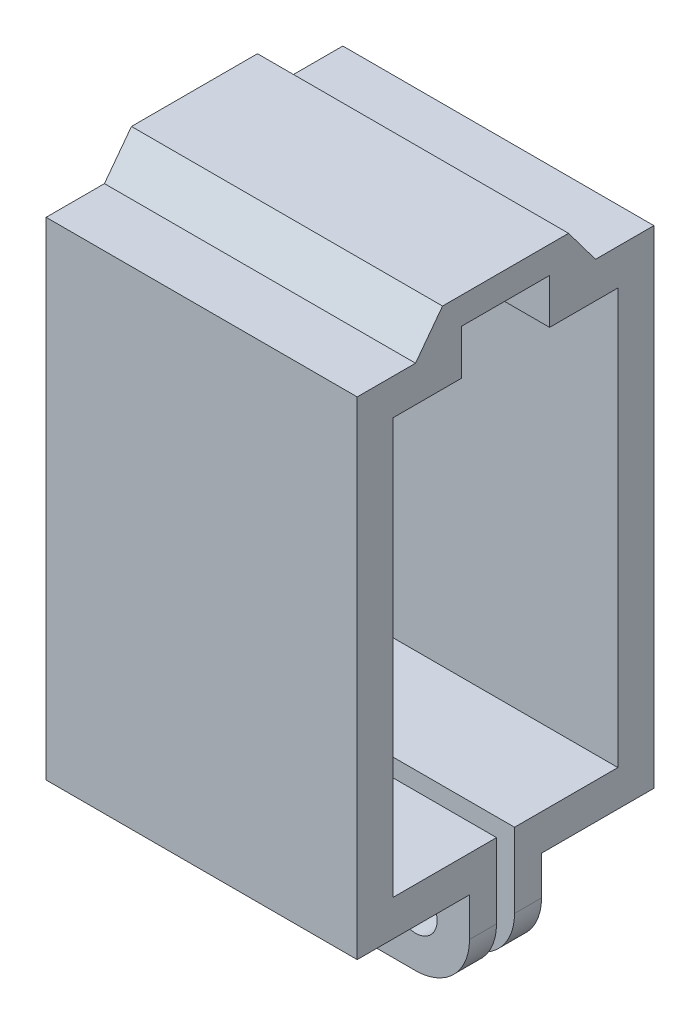
ISO-10303-21;
HEADER;
FILE_DESCRIPTION(('STEP AP214'),'2;1');
FILE_NAME('part.step','',(''),(''),'','','');
FILE_SCHEMA(('AUTOMOTIVE_DESIGN { 1 0 10303 214 1 1 1 1 }'));
ENDSEC;
DATA;
#1=APPLICATION_CONTEXT('core data for automotive mechanical design processes');
#2=APPLICATION_PROTOCOL_DEFINITION('international standard','automotive_design',2000,#1);
#3=PRODUCT_CONTEXT('',#1,'mechanical');
#4=PRODUCT('Part','Part','',(#3));
#5=PRODUCT_RELATED_PRODUCT_CATEGORY('part','',(#4));
#6=PRODUCT_DEFINITION_FORMATION('','',#4);
#7=PRODUCT_DEFINITION_CONTEXT('part definition',#1,'design');
#8=PRODUCT_DEFINITION('design','',#6,#7);
#9=PRODUCT_DEFINITION_SHAPE('','',#8);
#10=(LENGTH_UNIT() NAMED_UNIT(*) SI_UNIT(.MILLI.,.METRE.));
#11=(NAMED_UNIT(*) PLANE_ANGLE_UNIT() SI_UNIT($,.RADIAN.));
#12=(NAMED_UNIT(*) SI_UNIT($,.STERADIAN.) SOLID_ANGLE_UNIT());
#13=UNCERTAINTY_MEASURE_WITH_UNIT(LENGTH_MEASURE(1.E-05),#10,'distance_accuracy_value','');
#14=(GEOMETRIC_REPRESENTATION_CONTEXT(3) GLOBAL_UNCERTAINTY_ASSIGNED_CONTEXT((#13)) GLOBAL_UNIT_ASSIGNED_CONTEXT((#10,
#11,#12)) REPRESENTATION_CONTEXT('',''));
#15=CARTESIAN_POINT('',(0.,0.,0.));
#16=DIRECTION('',(0.,0.,1.));
#17=DIRECTION('',(1.,0.,0.));
#18=AXIS2_PLACEMENT_3D('',#15,#16,#17);
#19=CARTESIAN_POINT('',(49.4724202470213,-16.8311,6.23999999999999));
#20=DIRECTION('',(0.,1.,0.));
#21=DIRECTION('',(0.,0.,1.));
#22=AXIS2_PLACEMENT_3D('',#19,#20,#21);
#23=PLANE('',#22);
#24=DIRECTION('',(1.,0.,0.));
#25=VECTOR('',#24,1.);
#26=CARTESIAN_POINT('',(0.,-16.8311,0.500000000000001));
#27=LINE('',#26,#25);
#28=CARTESIAN_POINT('',(0.,-16.8311,0.500000000000001));
#29=VERTEX_POINT('',#28);
#30=CARTESIAN_POINT('',(17.2796,-16.8311,0.500000000000006));
#31=VERTEX_POINT('',#30);
#32=EDGE_CURVE('E229',#29,#31,#27,.T.);
#33=ORIENTED_EDGE('',*,*,#32,.F.);
#34=DIRECTION('',(0.,0.,-1.));
#35=VECTOR('',#34,1.);
#36=CARTESIAN_POINT('',(0.,-16.8311,6.23999999999999));
#37=LINE('',#36,#35);
#38=CARTESIAN_POINT('',(0.,-16.8311,6.23999999999999));
#39=VERTEX_POINT('',#38);
#40=EDGE_CURVE('E248',#39,#29,#37,.T.);
#41=ORIENTED_EDGE('',*,*,#40,.F.);
#42=DIRECTION('',(-1.,0.,0.));
#43=VECTOR('',#42,1.);
#44=CARTESIAN_POINT('',(49.4724202470213,-16.8311,6.23999999999999));
#45=LINE('',#44,#43);
#46=CARTESIAN_POINT('',(17.2796,-16.8311,6.23999999999999));
#47=VERTEX_POINT('',#46);
#48=EDGE_CURVE('E257',#47,#39,#45,.T.);
#49=ORIENTED_EDGE('',*,*,#48,.F.);
#50=DIRECTION('',(0.,0.,-1.));
#51=VECTOR('',#50,1.);
#52=CARTESIAN_POINT('',(17.2796,-16.8311,6.23999999999998));
#53=LINE('',#52,#51);
#54=EDGE_CURVE('E288',#47,#31,#53,.T.);
#55=ORIENTED_EDGE('',*,*,#54,.T.);
#56=EDGE_LOOP('',(#33,#41,#49,#55));
#57=FACE_BOUND('',#56,.T.);
#58=ADVANCED_FACE('F35',(#57),#23,.T.);
#59=CARTESIAN_POINT('',(-6.5209278480905,-23.9811000000002,2.));
#60=DIRECTION('',(0.,-1.,0.));
#61=DIRECTION('',(0.,0.,-1.));
#62=AXIS2_PLACEMENT_3D('',#59,#60,#61);
#63=PLANE('',#62);
#64=DIRECTION('',(1.,0.,0.));
#65=VECTOR('',#64,1.);
#66=CARTESIAN_POINT('',(0.,-23.9811000000002,0.5));
#67=LINE('',#66,#65);
#68=CARTESIAN_POINT('',(3.,-23.9811000000002,0.500000000000001));
#69=VERTEX_POINT('',#68);
#70=CARTESIAN_POINT('',(14.2796000000001,-23.9811000000002,0.500000000000004));
#71=VERTEX_POINT('',#70);
#72=EDGE_CURVE('E241',#69,#71,#67,.T.);
#73=ORIENTED_EDGE('',*,*,#72,.T.);
#74=DIRECTION('',(0.,0.,-1.));
#75=VECTOR('',#74,1.);
#76=CARTESIAN_POINT('',(14.2796,-23.9811000000002,2.00000000000001));
#77=LINE('',#76,#75);
#78=CARTESIAN_POINT('',(14.2796,-23.9811000000002,2.00000000000001));
#79=VERTEX_POINT('',#78);
#80=EDGE_CURVE('E299',#71,#79,#77,.F.);
#81=ORIENTED_EDGE('',*,*,#80,.T.);
#82=DIRECTION('',(1.,0.,0.));
#83=VECTOR('',#82,1.);
#84=CARTESIAN_POINT('',(-6.5209278480905,-23.9811000000002,2.));
#85=LINE('',#84,#83);
#86=CARTESIAN_POINT('',(3.,-23.9811000000002,2.));
#87=VERTEX_POINT('',#86);
#88=EDGE_CURVE('E359',#87,#79,#85,.T.);
#89=ORIENTED_EDGE('',*,*,#88,.F.);
#90=DIRECTION('',(0.,0.,1.));
#91=VECTOR('',#90,1.);
#92=CARTESIAN_POINT('',(3.,-23.9811,-2.));
#93=LINE('',#92,#91);
#94=EDGE_CURVE('E304',#87,#69,#93,.F.);
#95=ORIENTED_EDGE('',*,*,#94,.T.);
#96=EDGE_LOOP('',(#73,#81,#89,#95));
#97=FACE_BOUND('',#96,.T.);
#98=ADVANCED_FACE('F550',(#97),#63,.T.);
#99=CARTESIAN_POINT('',(3.,-20.9811000000001,-1.14648681173724E-12));
#100=DIRECTION('',(0.,0.,-1.));
#101=DIRECTION('',(0.,1.,0.));
#102=AXIS2_PLACEMENT_3D('',#99,#100,#101);
#103=CYLINDRICAL_SURFACE('',#102,3.);
#104=CARTESIAN_POINT('',(3.,-20.9811000000001,0.500000000000002));
#105=DIRECTION('',(0.,0.,1.));
#106=DIRECTION('',(1.,0.,0.));
#107=AXIS2_PLACEMENT_3D('',#104,#105,#106);
#108=CIRCLE('',#107,3.);
#109=CARTESIAN_POINT('',(0.,-20.9811000000001,0.500000000000001));
#110=VERTEX_POINT('',#109);
#111=EDGE_CURVE('E346',#69,#110,#108,.F.);
#112=ORIENTED_EDGE('',*,*,#111,.F.);
#113=ORIENTED_EDGE('',*,*,#94,.F.);
#114=CARTESIAN_POINT('',(3.,-20.9811000000002,2.));
#115=DIRECTION('',(0.,0.,1.));
#116=DIRECTION('',(1.,0.,0.));
#117=AXIS2_PLACEMENT_3D('',#114,#115,#116);
#118=CIRCLE('',#117,3.);
#119=CARTESIAN_POINT('',(0.,-20.9811000000002,2.));
#120=VERTEX_POINT('',#119);
#121=EDGE_CURVE('E297',#120,#87,#118,.T.);
#122=ORIENTED_EDGE('',*,*,#121,.F.);
#123=DIRECTION('',(0.,0.,1.));
#124=VECTOR('',#123,1.);
#125=CARTESIAN_POINT('',(0.,-20.9811000000002,2.00000000000017));
#126=LINE('',#125,#124);
#127=EDGE_CURVE('E293',#110,#120,#126,.T.);
#128=ORIENTED_EDGE('',*,*,#127,.F.);
#129=EDGE_LOOP('',(#112,#113,#122,#128));
#130=FACE_BOUND('',#129,.T.);
#131=ADVANCED_FACE('F463',(#130),#103,.T.);
#132=CARTESIAN_POINT('',(14.2796000000001,-20.9810999999998,-6.09000000000162));
#133=DIRECTION('',(0.,0.,-1.));
#134=DIRECTION('',(0.,1.,0.));
#135=AXIS2_PLACEMENT_3D('',#132,#133,#134);
#136=CYLINDRICAL_SURFACE('',#135,3.);
#137=CARTESIAN_POINT('',(14.2796000000001,-20.9811000000001,0.500000000000005));
#138=DIRECTION('',(0.,0.,1.));
#139=DIRECTION('',(1.,0.,0.));
#140=AXIS2_PLACEMENT_3D('',#137,#138,#139);
#141=CIRCLE('',#140,3.);
#142=CARTESIAN_POINT('',(17.2796,-20.9811000000001,0.500000000000006));
#143=VERTEX_POINT('',#142);
#144=EDGE_CURVE('E11',#143,#71,#141,.F.);
#145=ORIENTED_EDGE('',*,*,#144,.F.);
#146=DIRECTION('',(0.,0.,-1.));
#147=VECTOR('',#146,1.);
#148=CARTESIAN_POINT('',(17.2796000000001,-20.9810999999998,-6.09000000000162));
#149=LINE('',#148,#147);
#150=CARTESIAN_POINT('',(17.2796,-20.9811000000002,2.00000000000001));
#151=VERTEX_POINT('',#150);
#152=EDGE_CURVE('E312',#151,#143,#149,.T.);
#153=ORIENTED_EDGE('',*,*,#152,.F.);
#154=CARTESIAN_POINT('',(14.2796,-20.9811000000002,2.));
#155=DIRECTION('',(0.,0.,1.));
#156=DIRECTION('',(1.,0.,0.));
#157=AXIS2_PLACEMENT_3D('',#154,#155,#156);
#158=CIRCLE('',#157,3.);
#159=EDGE_CURVE('E295',#79,#151,#158,.T.);
#160=ORIENTED_EDGE('',*,*,#159,.F.);
#161=ORIENTED_EDGE('',*,*,#80,.F.);
#162=EDGE_LOOP('',(#145,#153,#160,#161));
#163=FACE_BOUND('',#162,.T.);
#164=ADVANCED_FACE('F546',(#163),#136,.T.);
#165=CARTESIAN_POINT('',(49.4724202470213,-18.8311,8.23999999999999));
#166=DIRECTION('',(0.,1.,0.));
#167=DIRECTION('',(0.,0.,1.));
#168=AXIS2_PLACEMENT_3D('',#165,#166,#167);
#169=PLANE('',#168);
#170=DIRECTION('',(1.,0.,0.));
#171=VECTOR('',#170,1.);
#172=CARTESIAN_POINT('',(-6.5209278480905,-18.8311,-2.));
#173=LINE('',#172,#171);
#174=CARTESIAN_POINT('',(0.,-18.8311,-1.99999999999999));
#175=VERTEX_POINT('',#174);
#176=CARTESIAN_POINT('',(17.2796,-18.8311,-1.99999999999999));
#177=VERTEX_POINT('',#176);
#178=EDGE_CURVE('E361',#175,#177,#173,.T.);
#179=ORIENTED_EDGE('',*,*,#178,.F.);
#180=DIRECTION('',(0.,0.,-1.));
#181=VECTOR('',#180,1.);
#182=CARTESIAN_POINT('',(0.,-18.8311,8.23999999999999));
#183=LINE('',#182,#181);
#184=CARTESIAN_POINT('',(0.,-18.8311,-8.24000000000001));
#185=VERTEX_POINT('',#184);
#186=EDGE_CURVE('E273',#175,#185,#183,.T.);
#187=ORIENTED_EDGE('',*,*,#186,.T.);
#188=DIRECTION('',(-1.,0.,0.));
#189=VECTOR('',#188,1.);
#190=CARTESIAN_POINT('',(49.4724202470213,-18.8311,-8.24000000000001));
#191=LINE('',#190,#189);
#192=CARTESIAN_POINT('',(17.2796,-18.8311,-8.24));
#193=VERTEX_POINT('',#192);
#194=EDGE_CURVE('E277',#193,#185,#191,.T.);
#195=ORIENTED_EDGE('',*,*,#194,.F.);
#196=DIRECTION('',(0.,0.,-1.));
#197=VECTOR('',#196,1.);
#198=CARTESIAN_POINT('',(17.2796,-18.8311,8.23999999999998));
#199=LINE('',#198,#197);
#200=EDGE_CURVE('E426',#177,#193,#199,.T.);
#201=ORIENTED_EDGE('',*,*,#200,.F.);
#202=EDGE_LOOP('',(#179,#187,#195,#201));
#203=FACE_BOUND('',#202,.T.);
#204=ADVANCED_FACE('F663',(#203),#169,.F.);
#205=CARTESIAN_POINT('',(49.4724202470213,6.24,-6.24000000000001));
#206=DIRECTION('',(0.,-1.,0.));
#207=DIRECTION('',(0.,0.,-1.));
#208=AXIS2_PLACEMENT_3D('',#205,#206,#207);
#209=PLANE('',#208);
#210=DIRECTION('',(-1.,0.,0.));
#211=VECTOR('',#210,1.);
#212=CARTESIAN_POINT('',(49.4724202470213,6.24,2.44779999999987));
#213=LINE('',#212,#211);
#214=CARTESIAN_POINT('',(17.2796,6.24,2.44779999999986));
#215=VERTEX_POINT('',#214);
#216=CARTESIAN_POINT('',(0.,6.24,2.44779999999985));
#217=VERTEX_POINT('',#216);
#218=EDGE_CURVE('E389',#215,#217,#213,.T.);
#219=ORIENTED_EDGE('',*,*,#218,.F.);
#220=DIRECTION('',(0.,0.,1.));
#221=VECTOR('',#220,1.);
#222=CARTESIAN_POINT('',(17.2796,6.24,-6.24000000000002));
#223=LINE('',#222,#221);
#224=CARTESIAN_POINT('',(17.2796,6.24,6.23999999999999));
#225=VERTEX_POINT('',#224);
#226=EDGE_CURVE('E419',#215,#225,#223,.T.);
#227=ORIENTED_EDGE('',*,*,#226,.T.);
#228=DIRECTION('',(-1.,0.,0.));
#229=VECTOR('',#228,1.);
#230=CARTESIAN_POINT('',(49.4724202470213,6.24,6.23999999999999));
#231=LINE('',#230,#229);
#232=CARTESIAN_POINT('',(0.,6.24,6.23999999999999));
#233=VERTEX_POINT('',#232);
#234=EDGE_CURVE('E259',#225,#233,#231,.T.);
#235=ORIENTED_EDGE('',*,*,#234,.T.);
#236=DIRECTION('',(0.,0.,1.));
#237=VECTOR('',#236,1.);
#238=CARTESIAN_POINT('',(0.,6.24,-6.24000000000001));
#239=LINE('',#238,#237);
#240=EDGE_CURVE('E441',#217,#233,#239,.T.);
#241=ORIENTED_EDGE('',*,*,#240,.F.);
#242=EDGE_LOOP('',(#219,#227,#235,#241));
#243=FACE_BOUND('',#242,.T.);
#244=ADVANCED_FACE('F450',(#243),#209,.T.);
#245=CARTESIAN_POINT('',(49.4724202470213,8.24,-8.24000000000001));
#246=DIRECTION('',(0.,-1.,0.));
#247=DIRECTION('',(0.,0.,-1.));
#248=AXIS2_PLACEMENT_3D('',#245,#246,#247);
#249=PLANE('',#248);
#250=DIRECTION('',(1.,0.,0.));
#251=VECTOR('',#250,1.);
#252=CARTESIAN_POINT('',(-10.1980390271856,8.23999999999999,5.));
#253=LINE('',#252,#251);
#254=CARTESIAN_POINT('',(0.,8.23999999999999,5.00000000000001));
#255=VERTEX_POINT('',#254);
#256=CARTESIAN_POINT('',(17.2796,8.23999999999999,5.00000000000001));
#257=VERTEX_POINT('',#256);
#258=EDGE_CURVE('E409',#255,#257,#253,.T.);
#259=ORIENTED_EDGE('',*,*,#258,.F.);
#260=DIRECTION('',(0.,0.,1.));
#261=VECTOR('',#260,1.);
#262=CARTESIAN_POINT('',(0.,8.24,-8.24000000000001));
#263=LINE('',#262,#261);
#264=CARTESIAN_POINT('',(0.,8.23999999999999,8.23999999999999));
#265=VERTEX_POINT('',#264);
#266=EDGE_CURVE('E267',#255,#265,#263,.T.);
#267=ORIENTED_EDGE('',*,*,#266,.T.);
#268=DIRECTION('',(-1.,0.,0.));
#269=VECTOR('',#268,1.);
#270=CARTESIAN_POINT('',(49.4724202470213,8.23999999999999,8.23999999999999));
#271=LINE('',#270,#269);
#272=CARTESIAN_POINT('',(17.2796,8.23999999999999,8.23999999999999));
#273=VERTEX_POINT('',#272);
#274=EDGE_CURVE('E282',#273,#265,#271,.T.);
#275=ORIENTED_EDGE('',*,*,#274,.F.);
#276=DIRECTION('',(0.,0.,1.));
#277=VECTOR('',#276,1.);
#278=CARTESIAN_POINT('',(17.2796,8.24,-8.24000000000002));
#279=LINE('',#278,#277);
#280=EDGE_CURVE('E433',#257,#273,#279,.T.);
#281=ORIENTED_EDGE('',*,*,#280,.F.);
#282=EDGE_LOOP('',(#259,#267,#275,#281));
#283=FACE_BOUND('',#282,.T.);
#284=ADVANCED_FACE('F748',(#283),#249,.F.);
#285=CARTESIAN_POINT('',(0.,-18.8311,8.23999999999999));
#286=VERTEX_POINT('',#285);
#287=CARTESIAN_POINT('',(0.,-18.8311,2.00000000000001));
#288=VERTEX_POINT('',#287);
#289=EDGE_CURVE('E274',#286,#288,#183,.T.);
#290=ORIENTED_EDGE('',*,*,#289,.T.);
#291=DIRECTION('',(1.,0.,0.));
#292=VECTOR('',#291,1.);
#293=CARTESIAN_POINT('',(-6.5209278480905,-18.8311,2.));
#294=LINE('',#293,#292);
#295=CARTESIAN_POINT('',(17.2796,-18.8311,2.00000000000001));
#296=VERTEX_POINT('',#295);
#297=EDGE_CURVE('E352',#288,#296,#294,.T.);
#298=ORIENTED_EDGE('',*,*,#297,.T.);
#299=CARTESIAN_POINT('',(17.2796,-18.8311,8.23999999999999));
#300=VERTEX_POINT('',#299);
#301=EDGE_CURVE('E427',#300,#296,#199,.T.);
#302=ORIENTED_EDGE('',*,*,#301,.F.);
#303=DIRECTION('',(-1.,0.,0.));
#304=VECTOR('',#303,1.);
#305=CARTESIAN_POINT('',(49.4724202470213,-18.8311,8.23999999999999));
#306=LINE('',#305,#304);
#307=EDGE_CURVE('E280',#300,#286,#306,.T.);
#308=ORIENTED_EDGE('',*,*,#307,.T.);
#309=EDGE_LOOP('',(#290,#298,#302,#308));
#310=FACE_BOUND('',#309,.T.);
#311=ADVANCED_FACE('F474',(#310),#169,.F.);
#312=CARTESIAN_POINT('',(49.4724202470213,8.23999999999999,8.23999999999999));
#313=DIRECTION('',(0.,0.,-1.));
#314=DIRECTION('',(0.,1.,0.));
#315=AXIS2_PLACEMENT_3D('',#312,#313,#314);
#316=PLANE('',#315);
#317=DIRECTION('',(0.,-1.,0.));
#318=VECTOR('',#317,1.);
#319=CARTESIAN_POINT('',(17.2796,8.23999999999999,8.23999999999999));
#320=LINE('',#319,#318);
#321=EDGE_CURVE('E430',#273,#300,#320,.T.);
#322=ORIENTED_EDGE('',*,*,#321,.F.);
#323=ORIENTED_EDGE('',*,*,#274,.T.);
#324=DIRECTION('',(0.,-1.,0.));
#325=VECTOR('',#324,1.);
#326=CARTESIAN_POINT('',(0.,8.23999999999999,8.23999999999999));
#327=LINE('',#326,#325);
#328=EDGE_CURVE('E270',#265,#286,#327,.T.);
#329=ORIENTED_EDGE('',*,*,#328,.T.);
#330=ORIENTED_EDGE('',*,*,#307,.F.);
#331=EDGE_LOOP('',(#322,#323,#329,#330));
#332=FACE_BOUND('',#331,.T.);
#333=ADVANCED_FACE('F478',(#332),#316,.F.);
#334=CARTESIAN_POINT('',(0.,8.24,-8.24000000000001));
#335=VERTEX_POINT('',#334);
#336=CARTESIAN_POINT('',(0.,8.24,-5.));
#337=VERTEX_POINT('',#336);
#338=EDGE_CURVE('E268',#335,#337,#263,.T.);
#339=ORIENTED_EDGE('',*,*,#338,.T.);
#340=DIRECTION('',(1.,0.,0.));
#341=VECTOR('',#340,1.);
#342=CARTESIAN_POINT('',(-10.1980390271856,8.23999999999999,-5.));
#343=LINE('',#342,#341);
#344=CARTESIAN_POINT('',(17.2796,8.24,-5.));
#345=VERTEX_POINT('',#344);
#346=EDGE_CURVE('E413',#337,#345,#343,.T.);
#347=ORIENTED_EDGE('',*,*,#346,.T.);
#348=CARTESIAN_POINT('',(17.2796,8.24,-8.24000000000001));
#349=VERTEX_POINT('',#348);
#350=EDGE_CURVE('E434',#349,#345,#279,.T.);
#351=ORIENTED_EDGE('',*,*,#350,.F.);
#352=DIRECTION('',(-1.,0.,0.));
#353=VECTOR('',#352,1.);
#354=CARTESIAN_POINT('',(49.4724202470213,8.24,-8.24000000000001));
#355=LINE('',#354,#353);
#356=EDGE_CURVE('E285',#349,#335,#355,.T.);
#357=ORIENTED_EDGE('',*,*,#356,.T.);
#358=EDGE_LOOP('',(#339,#347,#351,#357));
#359=FACE_BOUND('',#358,.T.);
#360=ADVANCED_FACE('F499',(#359),#249,.F.);
#361=CARTESIAN_POINT('',(49.4724202470213,-18.8311,-8.24000000000001));
#362=DIRECTION('',(0.,0.,1.));
#363=DIRECTION('',(1.,0.,0.));
#364=AXIS2_PLACEMENT_3D('',#361,#362,#363);
#365=PLANE('',#364);
#366=DIRECTION('',(0.,1.,0.));
#367=VECTOR('',#366,1.);
#368=CARTESIAN_POINT('',(17.2796,-18.8311,-8.24000000000001));
#369=LINE('',#368,#367);
#370=EDGE_CURVE('E437',#193,#349,#369,.T.);
#371=ORIENTED_EDGE('',*,*,#370,.F.);
#372=ORIENTED_EDGE('',*,*,#194,.T.);
#373=DIRECTION('',(0.,1.,0.));
#374=VECTOR('',#373,1.);
#375=CARTESIAN_POINT('',(0.,-18.8311,-8.24000000000001));
#376=LINE('',#375,#374);
#377=EDGE_CURVE('E264',#185,#335,#376,.T.);
#378=ORIENTED_EDGE('',*,*,#377,.T.);
#379=ORIENTED_EDGE('',*,*,#356,.F.);
#380=EDGE_LOOP('',(#371,#372,#378,#379));
#381=FACE_BOUND('',#380,.T.);
#382=ADVANCED_FACE('F507',(#381),#365,.F.);
#383=CARTESIAN_POINT('',(0.,0.,0.));
#384=DIRECTION('',(1.,0.,0.));
#385=DIRECTION('',(0.,0.,-1.));
#386=AXIS2_PLACEMENT_3D('',#383,#384,#385);
#387=PLANE('',#386);
#388=ORIENTED_EDGE('',*,*,#40,.T.);
#389=DIRECTION('',(0.,-1.,0.));
#390=VECTOR('',#389,1.);
#391=CARTESIAN_POINT('',(0.,-16.8311,0.500000000000001));
#392=LINE('',#391,#390);
#393=EDGE_CURVE('E242',#29,#110,#392,.T.);
#394=ORIENTED_EDGE('',*,*,#393,.T.);
#395=ORIENTED_EDGE('',*,*,#127,.T.);
#396=DIRECTION('',(0.,1.,0.));
#397=VECTOR('',#396,1.);
#398=CARTESIAN_POINT('',(0.,-18.8311,2.));
#399=LINE('',#398,#397);
#400=EDGE_CURVE('E351',#120,#288,#399,.T.);
#401=ORIENTED_EDGE('',*,*,#400,.T.);
#402=ORIENTED_EDGE('',*,*,#289,.F.);
#403=ORIENTED_EDGE('',*,*,#328,.F.);
#404=ORIENTED_EDGE('',*,*,#266,.F.);
#405=DIRECTION('',(0.,0.8,-0.6));
#406=VECTOR('',#405,1.);
#407=CARTESIAN_POINT('',(0.,8.24,5.));
#408=LINE('',#407,#406);
#409=CARTESIAN_POINT('',(0.,10.24,3.50000000000001));
#410=VERTEX_POINT('',#409);
#411=EDGE_CURVE('E398',#255,#410,#408,.T.);
#412=ORIENTED_EDGE('',*,*,#411,.T.);
#413=DIRECTION('',(0.,0.,-1.));
#414=VECTOR('',#413,1.);
#415=CARTESIAN_POINT('',(0.,10.24,3.5));
#416=LINE('',#415,#414);
#417=CARTESIAN_POINT('',(0.,10.24,-3.5));
#418=VERTEX_POINT('',#417);
#419=EDGE_CURVE('E395',#410,#418,#416,.T.);
#420=ORIENTED_EDGE('',*,*,#419,.T.);
#421=DIRECTION('',(0.,-0.8,-0.6));
#422=VECTOR('',#421,1.);
#423=CARTESIAN_POINT('',(0.,8.23999999999999,-5.));
#424=LINE('',#423,#422);
#425=EDGE_CURVE('E392',#418,#337,#424,.T.);
#426=ORIENTED_EDGE('',*,*,#425,.T.);
#427=ORIENTED_EDGE('',*,*,#338,.F.);
#428=ORIENTED_EDGE('',*,*,#377,.F.);
#429=ORIENTED_EDGE('',*,*,#186,.F.);
#430=DIRECTION('',(0.,-1.,0.));
#431=VECTOR('',#430,1.);
#432=CARTESIAN_POINT('',(0.,-18.8311,-2.));
#433=LINE('',#432,#431);
#434=CARTESIAN_POINT('',(0.,-20.9811,-2.));
#435=VERTEX_POINT('',#434);
#436=EDGE_CURVE('E349',#175,#435,#433,.T.);
#437=ORIENTED_EDGE('',*,*,#436,.T.);
#438=CARTESIAN_POINT('',(0.,-20.9811000000001,-0.499999999999998));
#439=VERTEX_POINT('',#438);
#440=EDGE_CURVE('E240',#435,#439,#126,.T.);
#441=ORIENTED_EDGE('',*,*,#440,.T.);
#442=DIRECTION('',(0.,1.,0.));
#443=VECTOR('',#442,1.);
#444=CARTESIAN_POINT('',(0.,-16.8311,-0.499999999999999));
#445=LINE('',#444,#443);
#446=CARTESIAN_POINT('',(0.,-16.8311,-0.499999999999999));
#447=VERTEX_POINT('',#446);
#448=EDGE_CURVE('E222',#439,#447,#445,.T.);
#449=ORIENTED_EDGE('',*,*,#448,.T.);
#450=CARTESIAN_POINT('',(0.,-16.8311,-6.24000000000001));
#451=VERTEX_POINT('',#450);
#452=EDGE_CURVE('E236',#447,#451,#37,.T.);
#453=ORIENTED_EDGE('',*,*,#452,.T.);
#454=DIRECTION('',(0.,1.,0.));
#455=VECTOR('',#454,1.);
#456=CARTESIAN_POINT('',(0.,-16.8311,-6.24000000000001));
#457=LINE('',#456,#455);
#458=CARTESIAN_POINT('',(0.,6.24,-6.24000000000001));
#459=VERTEX_POINT('',#458);
#460=EDGE_CURVE('E440',#451,#459,#457,.T.);
#461=ORIENTED_EDGE('',*,*,#460,.T.);
#462=CARTESIAN_POINT('',(0.,6.24,-2.44780000000015));
#463=VERTEX_POINT('',#462);
#464=EDGE_CURVE('E252',#459,#463,#239,.T.);
#465=ORIENTED_EDGE('',*,*,#464,.T.);
#466=DIRECTION('',(0.,1.,0.));
#467=VECTOR('',#466,1.);
#468=CARTESIAN_POINT('',(0.,5.09000000000005,-2.44780000000015));
#469=LINE('',#468,#467);
#470=CARTESIAN_POINT('',(0.,8.74,-2.44780000000015));
#471=VERTEX_POINT('',#470);
#472=EDGE_CURVE('E372',#463,#471,#469,.T.);
#473=ORIENTED_EDGE('',*,*,#472,.T.);
#474=DIRECTION('',(0.,0.,1.));
#475=VECTOR('',#474,1.);
#476=CARTESIAN_POINT('',(0.,8.74,2.44779999999985));
#477=LINE('',#476,#475);
#478=CARTESIAN_POINT('',(0.,8.74,2.44779999999985));
#479=VERTEX_POINT('',#478);
#480=EDGE_CURVE('E376',#471,#479,#477,.T.);
#481=ORIENTED_EDGE('',*,*,#480,.T.);
#482=DIRECTION('',(0.,-1.,0.));
#483=VECTOR('',#482,1.);
#484=CARTESIAN_POINT('',(0.,8.74,2.44779999999985));
#485=LINE('',#484,#483);
#486=EDGE_CURVE('E369',#479,#217,#485,.T.);
#487=ORIENTED_EDGE('',*,*,#486,.T.);
#488=ORIENTED_EDGE('',*,*,#240,.T.);
#489=DIRECTION('',(0.,-1.,0.));
#490=VECTOR('',#489,1.);
#491=CARTESIAN_POINT('',(0.,6.24,6.23999999999999));
#492=LINE('',#491,#490);
#493=EDGE_CURVE('E249',#233,#39,#492,.T.);
#494=ORIENTED_EDGE('',*,*,#493,.T.);
#495=EDGE_LOOP('',(#388,#394,#395,#401,#402,#403,#404,#412,#420,#426,#427,#428,#429,#437,#441,
#449,#453,#461,#465,#473,#481,#487,#488,#494));
#496=FACE_BOUND('',#495,.T.);
#497=ADVANCED_FACE('F234',(#496),#387,.F.);
#498=DIRECTION('',(1.,0.,0.));
#499=VECTOR('',#498,1.);
#500=CARTESIAN_POINT('',(0.,-16.8311,-0.499999999999999));
#501=LINE('',#500,#499);
#502=CARTESIAN_POINT('',(17.2796,-16.8311,-0.499999999999994));
#503=VERTEX_POINT('',#502);
#504=EDGE_CURVE('E219',#447,#503,#501,.T.);
#505=ORIENTED_EDGE('',*,*,#504,.T.);
#506=CARTESIAN_POINT('',(17.2796,-16.8311,-6.24000000000001));
#507=VERTEX_POINT('',#506);
#508=EDGE_CURVE('E287',#503,#507,#53,.T.);
#509=ORIENTED_EDGE('',*,*,#508,.T.);
#510=DIRECTION('',(-1.,0.,0.));
#511=VECTOR('',#510,1.);
#512=CARTESIAN_POINT('',(49.4724202470213,-16.8311,-6.24000000000001));
#513=LINE('',#512,#511);
#514=EDGE_CURVE('E246',#507,#451,#513,.T.);
#515=ORIENTED_EDGE('',*,*,#514,.T.);
#516=ORIENTED_EDGE('',*,*,#452,.F.);
#517=EDGE_LOOP('',(#505,#509,#515,#516));
#518=FACE_BOUND('',#517,.T.);
#519=ADVANCED_FACE('F244',(#518),#23,.T.);
#520=CARTESIAN_POINT('',(49.4724202470213,6.24,6.23999999999999));
#521=DIRECTION('',(0.,0.,-1.));
#522=DIRECTION('',(0.,1.,0.));
#523=AXIS2_PLACEMENT_3D('',#520,#521,#522);
#524=PLANE('',#523);
#525=ORIENTED_EDGE('',*,*,#234,.F.);
#526=DIRECTION('',(0.,-1.,0.));
#527=VECTOR('',#526,1.);
#528=CARTESIAN_POINT('',(17.2796,6.24,6.23999999999999));
#529=LINE('',#528,#527);
#530=EDGE_CURVE('E400',#225,#47,#529,.T.);
#531=ORIENTED_EDGE('',*,*,#530,.T.);
#532=ORIENTED_EDGE('',*,*,#48,.T.);
#533=ORIENTED_EDGE('',*,*,#493,.F.);
#534=EDGE_LOOP('',(#525,#531,#532,#533));
#535=FACE_BOUND('',#534,.T.);
#536=ADVANCED_FACE('F454',(#535),#524,.T.);
#537=DIRECTION('',(1.,0.,0.));
#538=VECTOR('',#537,1.);
#539=CARTESIAN_POINT('',(49.4724202470213,6.24,-2.44780000000013));
#540=LINE('',#539,#538);
#541=CARTESIAN_POINT('',(17.2796,6.24,-2.44780000000014));
#542=VERTEX_POINT('',#541);
#543=EDGE_CURVE('E385',#463,#542,#540,.T.);
#544=ORIENTED_EDGE('',*,*,#543,.F.);
#545=ORIENTED_EDGE('',*,*,#464,.F.);
#546=DIRECTION('',(-1.,0.,0.));
#547=VECTOR('',#546,1.);
#548=CARTESIAN_POINT('',(49.4724202470213,6.24,-6.24000000000001));
#549=LINE('',#548,#547);
#550=CARTESIAN_POINT('',(17.2796,6.24,-6.24000000000001));
#551=VERTEX_POINT('',#550);
#552=EDGE_CURVE('E262',#551,#459,#549,.T.);
#553=ORIENTED_EDGE('',*,*,#552,.F.);
#554=EDGE_CURVE('E420',#551,#542,#223,.T.);
#555=ORIENTED_EDGE('',*,*,#554,.T.);
#556=EDGE_LOOP('',(#544,#545,#553,#555));
#557=FACE_BOUND('',#556,.T.);
#558=ADVANCED_FACE('F533',(#557),#209,.T.);
#559=CARTESIAN_POINT('',(49.4724202470213,-16.8311,-6.24000000000001));
#560=DIRECTION('',(0.,0.,1.));
#561=DIRECTION('',(1.,0.,0.));
#562=AXIS2_PLACEMENT_3D('',#559,#560,#561);
#563=PLANE('',#562);
#564=ORIENTED_EDGE('',*,*,#514,.F.);
#565=DIRECTION('',(0.,1.,0.));
#566=VECTOR('',#565,1.);
#567=CARTESIAN_POINT('',(17.2796,-16.8311,-6.24000000000001));
#568=LINE('',#567,#566);
#569=EDGE_CURVE('E423',#507,#551,#568,.T.);
#570=ORIENTED_EDGE('',*,*,#569,.T.);
#571=ORIENTED_EDGE('',*,*,#552,.T.);
#572=ORIENTED_EDGE('',*,*,#460,.F.);
#573=EDGE_LOOP('',(#564,#570,#571,#572));
#574=FACE_BOUND('',#573,.T.);
#575=ADVANCED_FACE('F530',(#574),#563,.T.);
#576=CARTESIAN_POINT('',(17.2796000000001,6.09000000000005,-6.09000000000014));
#577=DIRECTION('',(1.,0.,0.));
#578=DIRECTION('',(0.,0.,1.));
#579=AXIS2_PLACEMENT_3D('',#576,#577,#578);
#580=PLANE('',#579);
#581=DIRECTION('',(0.,-1.,0.));
#582=VECTOR('',#581,1.);
#583=CARTESIAN_POINT('',(17.2796,-16.8311,0.500000000000006));
#584=LINE('',#583,#582);
#585=EDGE_CURVE('E51',#31,#143,#584,.T.);
#586=ORIENTED_EDGE('',*,*,#585,.F.);
#587=ORIENTED_EDGE('',*,*,#54,.F.);
#588=ORIENTED_EDGE('',*,*,#530,.F.);
#589=ORIENTED_EDGE('',*,*,#226,.F.);
#590=DIRECTION('',(0.,-1.,0.));
#591=VECTOR('',#590,1.);
#592=CARTESIAN_POINT('',(17.2796,8.74,2.44779999999986));
#593=LINE('',#592,#591);
#594=CARTESIAN_POINT('',(17.2796,8.74,2.44779999999986));
#595=VERTEX_POINT('',#594);
#596=EDGE_CURVE('E354',#595,#215,#593,.T.);
#597=ORIENTED_EDGE('',*,*,#596,.F.);
#598=DIRECTION('',(0.,0.,1.));
#599=VECTOR('',#598,1.);
#600=CARTESIAN_POINT('',(17.2796,8.74,2.44779999999986));
#601=LINE('',#600,#599);
#602=CARTESIAN_POINT('',(17.2796,8.74,-2.44780000000014));
#603=VERTEX_POINT('',#602);
#604=EDGE_CURVE('E373',#603,#595,#601,.T.);
#605=ORIENTED_EDGE('',*,*,#604,.F.);
#606=DIRECTION('',(0.,1.,0.));
#607=VECTOR('',#606,1.);
#608=CARTESIAN_POINT('',(17.2796000000001,6.09000000000005,-2.44780000000014));
#609=LINE('',#608,#607);
#610=EDGE_CURVE('E291',#542,#603,#609,.T.);
#611=ORIENTED_EDGE('',*,*,#610,.F.);
#612=ORIENTED_EDGE('',*,*,#554,.F.);
#613=ORIENTED_EDGE('',*,*,#569,.F.);
#614=ORIENTED_EDGE('',*,*,#508,.F.);
#615=DIRECTION('',(0.,1.,0.));
#616=VECTOR('',#615,1.);
#617=CARTESIAN_POINT('',(17.2796,-16.8311,-0.499999999999994));
#618=LINE('',#617,#616);
#619=CARTESIAN_POINT('',(17.2796,-20.9811000000001,-0.499999999999994));
#620=VERTEX_POINT('',#619);
#621=EDGE_CURVE('E225',#620,#503,#618,.T.);
#622=ORIENTED_EDGE('',*,*,#621,.F.);
#623=CARTESIAN_POINT('',(17.2796,-20.9811,-1.99999999999999));
#624=VERTEX_POINT('',#623);
#625=EDGE_CURVE('E311',#620,#624,#149,.T.);
#626=ORIENTED_EDGE('',*,*,#625,.T.);
#627=DIRECTION('',(0.,1.,0.));
#628=VECTOR('',#627,1.);
#629=CARTESIAN_POINT('',(17.2796,-18.8311,-1.99999999999999));
#630=LINE('',#629,#628);
#631=EDGE_CURVE('E357',#624,#177,#630,.T.);
#632=ORIENTED_EDGE('',*,*,#631,.T.);
#633=ORIENTED_EDGE('',*,*,#200,.T.);
#634=ORIENTED_EDGE('',*,*,#370,.T.);
#635=ORIENTED_EDGE('',*,*,#350,.T.);
#636=DIRECTION('',(0.,0.8,0.6));
#637=VECTOR('',#636,1.);
#638=CARTESIAN_POINT('',(17.2796,8.23999999999999,-4.99999999999999));
#639=LINE('',#638,#637);
#640=CARTESIAN_POINT('',(17.2796,10.24,-3.49999999999999));
#641=VERTEX_POINT('',#640);
#642=EDGE_CURVE('E403',#345,#641,#639,.T.);
#643=ORIENTED_EDGE('',*,*,#642,.T.);
#644=DIRECTION('',(0.,0.,1.));
#645=VECTOR('',#644,1.);
#646=CARTESIAN_POINT('',(17.2796,10.24,3.50000000000001));
#647=LINE('',#646,#645);
#648=CARTESIAN_POINT('',(17.2796,10.24,3.50000000000001));
#649=VERTEX_POINT('',#648);
#650=EDGE_CURVE('E406',#641,#649,#647,.T.);
#651=ORIENTED_EDGE('',*,*,#650,.T.);
#652=DIRECTION('',(0.,-0.8,0.6));
#653=VECTOR('',#652,1.);
#654=CARTESIAN_POINT('',(17.2796,8.23999999999999,5.00000000000001));
#655=LINE('',#654,#653);
#656=EDGE_CURVE('E391',#649,#257,#655,.T.);
#657=ORIENTED_EDGE('',*,*,#656,.T.);
#658=ORIENTED_EDGE('',*,*,#280,.T.);
#659=ORIENTED_EDGE('',*,*,#321,.T.);
#660=ORIENTED_EDGE('',*,*,#301,.T.);
#661=DIRECTION('',(0.,-1.,0.));
#662=VECTOR('',#661,1.);
#663=CARTESIAN_POINT('',(17.2796,-18.8311,2.));
#664=LINE('',#663,#662);
#665=EDGE_CURVE('E348',#296,#151,#664,.T.);
#666=ORIENTED_EDGE('',*,*,#665,.T.);
#667=ORIENTED_EDGE('',*,*,#152,.T.);
#668=EDGE_LOOP('',(#586,#587,#588,#589,#597,#605,#611,#612,#613,#614,#622,#626,#632,#633,#634,
#635,#643,#651,#657,#658,#659,#660,#666,#667));
#669=FACE_BOUND('',#668,.T.);
#670=ADVANCED_FACE('F502',(#669),#580,.T.);
#671=CARTESIAN_POINT('',(-10.1980390271856,8.23999999999999,5.));
#672=DIRECTION('',(0.,0.6,0.8));
#673=DIRECTION('',(0.,-0.8,0.6));
#674=AXIS2_PLACEMENT_3D('',#671,#672,#673);
#675=PLANE('',#674);
#676=ORIENTED_EDGE('',*,*,#411,.F.);
#677=ORIENTED_EDGE('',*,*,#258,.T.);
#678=ORIENTED_EDGE('',*,*,#656,.F.);
#679=DIRECTION('',(1.,0.,0.));
#680=VECTOR('',#679,1.);
#681=CARTESIAN_POINT('',(-10.1980390271856,10.24,3.5));
#682=LINE('',#681,#680);
#683=EDGE_CURVE('E396',#410,#649,#682,.T.);
#684=ORIENTED_EDGE('',*,*,#683,.F.);
#685=EDGE_LOOP('',(#676,#677,#678,#684));
#686=FACE_BOUND('',#685,.T.);
#687=ADVANCED_FACE('F486',(#686),#675,.T.);
#688=CARTESIAN_POINT('',(-10.1980390271856,10.24,3.5));
#689=DIRECTION('',(0.,1.,0.));
#690=DIRECTION('',(-1.,0.,0.));
#691=AXIS2_PLACEMENT_3D('',#688,#689,#690);
#692=PLANE('',#691);
#693=ORIENTED_EDGE('',*,*,#419,.F.);
#694=ORIENTED_EDGE('',*,*,#683,.T.);
#695=ORIENTED_EDGE('',*,*,#650,.F.);
#696=DIRECTION('',(1.,0.,0.));
#697=VECTOR('',#696,1.);
#698=CARTESIAN_POINT('',(-10.1980390271856,10.24,-3.5));
#699=LINE('',#698,#697);
#700=EDGE_CURVE('E411',#418,#641,#699,.T.);
#701=ORIENTED_EDGE('',*,*,#700,.F.);
#702=EDGE_LOOP('',(#693,#694,#695,#701));
#703=FACE_BOUND('',#702,.T.);
#704=ADVANCED_FACE('F490',(#703),#692,.T.);
#705=CARTESIAN_POINT('',(-10.1980390271856,8.23999999999999,-5.));
#706=DIRECTION('',(0.,0.6,-0.8));
#707=DIRECTION('',(0.,0.8,0.6));
#708=AXIS2_PLACEMENT_3D('',#705,#706,#707);
#709=PLANE('',#708);
#710=ORIENTED_EDGE('',*,*,#425,.F.);
#711=ORIENTED_EDGE('',*,*,#700,.T.);
#712=ORIENTED_EDGE('',*,*,#642,.F.);
#713=ORIENTED_EDGE('',*,*,#346,.F.);
#714=EDGE_LOOP('',(#710,#711,#712,#713));
#715=FACE_BOUND('',#714,.T.);
#716=ADVANCED_FACE('F496',(#715),#709,.T.);
#717=CARTESIAN_POINT('',(0.,8.74,2.44779999999985));
#718=DIRECTION('',(0.,0.,1.));
#719=DIRECTION('',(1.,0.,0.));
#720=AXIS2_PLACEMENT_3D('',#717,#718,#719);
#721=PLANE('',#720);
#722=ORIENTED_EDGE('',*,*,#218,.T.);
#723=ORIENTED_EDGE('',*,*,#486,.F.);
#724=DIRECTION('',(1.,0.,0.));
#725=VECTOR('',#724,1.);
#726=CARTESIAN_POINT('',(0.,8.74,2.44779999999985));
#727=LINE('',#726,#725);
#728=EDGE_CURVE('E383',#479,#595,#727,.T.);
#729=ORIENTED_EDGE('',*,*,#728,.T.);
#730=ORIENTED_EDGE('',*,*,#596,.T.);
#731=EDGE_LOOP('',(#722,#723,#729,#730));
#732=FACE_BOUND('',#731,.T.);
#733=ADVANCED_FACE('F542',(#732),#721,.F.);
#734=CARTESIAN_POINT('',(0.,8.74,2.44779999999985));
#735=DIRECTION('',(0.,1.,0.));
#736=DIRECTION('',(-1.,0.,0.));
#737=AXIS2_PLACEMENT_3D('',#734,#735,#736);
#738=PLANE('',#737);
#739=ORIENTED_EDGE('',*,*,#604,.T.);
#740=ORIENTED_EDGE('',*,*,#728,.F.);
#741=ORIENTED_EDGE('',*,*,#480,.F.);
#742=DIRECTION('',(1.,0.,0.));
#743=VECTOR('',#742,1.);
#744=CARTESIAN_POINT('',(0.,8.74,-2.44780000000015));
#745=LINE('',#744,#743);
#746=EDGE_CURVE('E379',#471,#603,#745,.T.);
#747=ORIENTED_EDGE('',*,*,#746,.T.);
#748=EDGE_LOOP('',(#739,#740,#741,#747));
#749=FACE_BOUND('',#748,.T.);
#750=ADVANCED_FACE('F539',(#749),#738,.F.);
#751=CARTESIAN_POINT('',(0.,5.09000000000005,-2.44780000000015));
#752=DIRECTION('',(0.,0.,-1.));
#753=DIRECTION('',(-1.,0.,0.));
#754=AXIS2_PLACEMENT_3D('',#751,#752,#753);
#755=PLANE('',#754);
#756=ORIENTED_EDGE('',*,*,#543,.T.);
#757=ORIENTED_EDGE('',*,*,#610,.T.);
#758=ORIENTED_EDGE('',*,*,#746,.F.);
#759=ORIENTED_EDGE('',*,*,#472,.F.);
#760=EDGE_LOOP('',(#756,#757,#758,#759));
#761=FACE_BOUND('',#760,.T.);
#762=ADVANCED_FACE('F535',(#761),#755,.F.);
#763=CARTESIAN_POINT('',(-6.5209278480905,-18.8311,2.));
#764=DIRECTION('',(0.,0.,1.));
#765=DIRECTION('',(1.,0.,0.));
#766=AXIS2_PLACEMENT_3D('',#763,#764,#765);
#767=PLANE('',#766);
#768=CARTESIAN_POINT('',(14.2796,-20.9811000000001,2.));
#769=DIRECTION('',(0.,0.,1.));
#770=DIRECTION('',(1.,0.,0.));
#771=AXIS2_PLACEMENT_3D('',#768,#769,#770);
#772=CIRCLE('',#771,1.2);
#773=CARTESIAN_POINT('',(15.4796,-20.9811000000001,2.00000000000001));
#774=VERTEX_POINT('',#773);
#775=EDGE_CURVE('E325',#774,#774,#772,.T.);
#776=ORIENTED_EDGE('',*,*,#775,.F.);
#777=EDGE_LOOP('',(#776));
#778=FACE_BOUND('',#777,.T.);
#779=CARTESIAN_POINT('',(3.,-20.9811000000001,2.));
#780=DIRECTION('',(0.,0.,1.));
#781=DIRECTION('',(1.,0.,0.));
#782=AXIS2_PLACEMENT_3D('',#779,#780,#781);
#783=CIRCLE('',#782,1.2);
#784=CARTESIAN_POINT('',(4.2,-20.9811000000001,2.));
#785=VERTEX_POINT('',#784);
#786=EDGE_CURVE('E322',#785,#785,#783,.T.);
#787=ORIENTED_EDGE('',*,*,#786,.F.);
#788=EDGE_LOOP('',(#787));
#789=FACE_BOUND('',#788,.T.);
#790=ORIENTED_EDGE('',*,*,#400,.F.);
#791=ORIENTED_EDGE('',*,*,#121,.T.);
#792=ORIENTED_EDGE('',*,*,#88,.T.);
#793=ORIENTED_EDGE('',*,*,#159,.T.);
#794=ORIENTED_EDGE('',*,*,#665,.F.);
#795=ORIENTED_EDGE('',*,*,#297,.F.);
#796=EDGE_LOOP('',(#790,#791,#792,#793,#794,#795));
#797=FACE_BOUND('',#796,.T.);
#798=ADVANCED_FACE('F469',(#778,#789,#797),#767,.T.);
#799=CARTESIAN_POINT('',(-6.5209278480905,-18.8311,-2.));
#800=DIRECTION('',(0.,0.,-1.));
#801=DIRECTION('',(-1.,0.,0.));
#802=AXIS2_PLACEMENT_3D('',#799,#800,#801);
#803=PLANE('',#802);
#804=CARTESIAN_POINT('',(14.2796,-20.9811000000001,-1.99999999999999));
#805=DIRECTION('',(0.,0.,-1.));
#806=DIRECTION('',(0.,1.,0.));
#807=AXIS2_PLACEMENT_3D('',#804,#805,#806);
#808=CIRCLE('',#807,1.2);
#809=CARTESIAN_POINT('',(14.2796,-19.7811000000001,-1.99999999999999));
#810=VERTEX_POINT('',#809);
#811=EDGE_CURVE('E596',#810,#810,#808,.T.);
#812=ORIENTED_EDGE('',*,*,#811,.F.);
#813=EDGE_LOOP('',(#812));
#814=FACE_BOUND('',#813,.T.);
#815=CARTESIAN_POINT('',(3.,-20.9811000000001,-2.));
#816=DIRECTION('',(0.,0.,-1.));
#817=DIRECTION('',(0.,1.,0.));
#818=AXIS2_PLACEMENT_3D('',#815,#816,#817);
#819=CIRCLE('',#818,1.2);
#820=CARTESIAN_POINT('',(3.,-19.7811000000001,-2.));
#821=VERTEX_POINT('',#820);
#822=EDGE_CURVE('E318',#821,#821,#819,.T.);
#823=ORIENTED_EDGE('',*,*,#822,.F.);
#824=EDGE_LOOP('',(#823));
#825=FACE_BOUND('',#824,.T.);
#826=DIRECTION('',(1.,0.,0.));
#827=VECTOR('',#826,1.);
#828=CARTESIAN_POINT('',(-6.5209278480905,-23.9811,-2.));
#829=LINE('',#828,#827);
#830=CARTESIAN_POINT('',(3.,-23.9811,-2.));
#831=VERTEX_POINT('',#830);
#832=CARTESIAN_POINT('',(14.2796,-23.9811,-1.99999999999999));
#833=VERTEX_POINT('',#832);
#834=EDGE_CURVE('E364',#831,#833,#829,.T.);
#835=ORIENTED_EDGE('',*,*,#834,.F.);
#836=CARTESIAN_POINT('',(3.,-20.9811,-2.));
#837=DIRECTION('',(0.,0.,-1.));
#838=DIRECTION('',(-1.,0.,0.));
#839=AXIS2_PLACEMENT_3D('',#836,#837,#838);
#840=CIRCLE('',#839,3.);
#841=EDGE_CURVE('E309',#831,#435,#840,.T.);
#842=ORIENTED_EDGE('',*,*,#841,.T.);
#843=ORIENTED_EDGE('',*,*,#436,.F.);
#844=ORIENTED_EDGE('',*,*,#178,.T.);
#845=ORIENTED_EDGE('',*,*,#631,.F.);
#846=CARTESIAN_POINT('',(14.2796000000001,-20.9811,-1.99999999999999));
#847=DIRECTION('',(0.,0.,-1.));
#848=DIRECTION('',(-1.,0.,0.));
#849=AXIS2_PLACEMENT_3D('',#846,#847,#848);
#850=CIRCLE('',#849,3.);
#851=EDGE_CURVE('E307',#624,#833,#850,.T.);
#852=ORIENTED_EDGE('',*,*,#851,.T.);
#853=EDGE_LOOP('',(#835,#842,#843,#844,#845,#852));
#854=FACE_BOUND('',#853,.T.);
#855=ADVANCED_FACE('F514',(#814,#825,#854),#803,.T.);
#856=DIRECTION('',(1.,0.,0.));
#857=VECTOR('',#856,1.);
#858=CARTESIAN_POINT('',(0.,-23.9811000000002,-0.499999999999998));
#859=LINE('',#858,#857);
#860=CARTESIAN_POINT('',(3.,-23.9811000000002,-0.499999999999997));
#861=VERTEX_POINT('',#860);
#862=CARTESIAN_POINT('',(14.2796,-23.9811000000001,-0.499999999999995));
#863=VERTEX_POINT('',#862);
#864=EDGE_CURVE('E59',#861,#863,#859,.T.);
#865=ORIENTED_EDGE('',*,*,#864,.F.);
#866=EDGE_CURVE('E303',#861,#831,#93,.F.);
#867=ORIENTED_EDGE('',*,*,#866,.T.);
#868=ORIENTED_EDGE('',*,*,#834,.T.);
#869=EDGE_CURVE('E300',#833,#863,#77,.F.);
#870=ORIENTED_EDGE('',*,*,#869,.T.);
#871=EDGE_LOOP('',(#865,#867,#868,#870));
#872=FACE_BOUND('',#871,.T.);
#873=ADVANCED_FACE('F521',(#872),#63,.T.);
#874=CARTESIAN_POINT('',(3.,-20.9811000000001,-0.499999999999998));
#875=DIRECTION('',(0.,0.,-1.));
#876=DIRECTION('',(-1.,0.,0.));
#877=AXIS2_PLACEMENT_3D('',#874,#875,#876);
#878=CIRCLE('',#877,3.);
#879=EDGE_CURVE('E340',#439,#861,#878,.F.);
#880=ORIENTED_EDGE('',*,*,#879,.F.);
#881=ORIENTED_EDGE('',*,*,#440,.F.);
#882=ORIENTED_EDGE('',*,*,#841,.F.);
#883=ORIENTED_EDGE('',*,*,#866,.F.);
#884=EDGE_LOOP('',(#880,#881,#882,#883));
#885=FACE_BOUND('',#884,.T.);
#886=ADVANCED_FACE('F519',(#885),#103,.T.);
#887=CARTESIAN_POINT('',(14.2796000000001,-20.9811000000001,-0.499999999999994));
#888=DIRECTION('',(0.,0.,-1.));
#889=DIRECTION('',(-1.,0.,0.));
#890=AXIS2_PLACEMENT_3D('',#887,#888,#889);
#891=CIRCLE('',#890,3.);
#892=EDGE_CURVE('E44',#863,#620,#891,.F.);
#893=ORIENTED_EDGE('',*,*,#892,.F.);
#894=ORIENTED_EDGE('',*,*,#869,.F.);
#895=ORIENTED_EDGE('',*,*,#851,.F.);
#896=ORIENTED_EDGE('',*,*,#625,.F.);
#897=EDGE_LOOP('',(#893,#894,#895,#896));
#898=FACE_BOUND('',#897,.T.);
#899=ADVANCED_FACE('F37',(#898),#136,.T.);
#900=CARTESIAN_POINT('',(0.,-16.8311,-0.499999999999999));
#901=DIRECTION('',(0.,0.,-1.));
#902=DIRECTION('',(-1.,0.,0.));
#903=AXIS2_PLACEMENT_3D('',#900,#901,#902);
#904=PLANE('',#903);
#905=CARTESIAN_POINT('',(14.2796,-20.9811000000001,-0.499999999999994));
#906=DIRECTION('',(0.,0.,-1.));
#907=DIRECTION('',(-1.,0.,0.));
#908=AXIS2_PLACEMENT_3D('',#905,#906,#907);
#909=CIRCLE('',#908,1.2);
#910=CARTESIAN_POINT('',(13.0796,-20.9811000000001,-0.499999999999995));
#911=VERTEX_POINT('',#910);
#912=EDGE_CURVE('E39',#911,#911,#909,.T.);
#913=ORIENTED_EDGE('',*,*,#912,.T.);
#914=EDGE_LOOP('',(#913));
#915=FACE_BOUND('',#914,.T.);
#916=CARTESIAN_POINT('',(3.,-20.9811000000001,-0.499999999999997));
#917=DIRECTION('',(0.,0.,-1.));
#918=DIRECTION('',(-1.,0.,0.));
#919=AXIS2_PLACEMENT_3D('',#916,#917,#918);
#920=CIRCLE('',#919,1.2);
#921=CARTESIAN_POINT('',(1.8,-20.9811000000001,-0.499999999999998));
#922=VERTEX_POINT('',#921);
#923=EDGE_CURVE('E317',#922,#922,#920,.T.);
#924=ORIENTED_EDGE('',*,*,#923,.T.);
#925=EDGE_LOOP('',(#924));
#926=FACE_BOUND('',#925,.T.);
#927=ORIENTED_EDGE('',*,*,#879,.T.);
#928=ORIENTED_EDGE('',*,*,#864,.T.);
#929=ORIENTED_EDGE('',*,*,#892,.T.);
#930=ORIENTED_EDGE('',*,*,#621,.T.);
#931=ORIENTED_EDGE('',*,*,#504,.F.);
#932=ORIENTED_EDGE('',*,*,#448,.F.);
#933=EDGE_LOOP('',(#927,#928,#929,#930,#931,#932));
#934=FACE_BOUND('',#933,.T.);
#935=ADVANCED_FACE('F221',(#915,#926,#934),#904,.F.);
#936=CARTESIAN_POINT('',(0.,-16.8311,0.500000000000001));
#937=DIRECTION('',(0.,0.,1.));
#938=DIRECTION('',(1.,0.,0.));
#939=AXIS2_PLACEMENT_3D('',#936,#937,#938);
#940=PLANE('',#939);
#941=CARTESIAN_POINT('',(14.2796,-20.9811000000001,0.500000000000005));
#942=DIRECTION('',(0.,0.,1.));
#943=DIRECTION('',(1.,0.,0.));
#944=AXIS2_PLACEMENT_3D('',#941,#942,#943);
#945=CIRCLE('',#944,1.2);
#946=CARTESIAN_POINT('',(15.4796,-20.9811000000001,0.500000000000005));
#947=VERTEX_POINT('',#946);
#948=EDGE_CURVE('E330',#947,#947,#945,.T.);
#949=ORIENTED_EDGE('',*,*,#948,.T.);
#950=EDGE_LOOP('',(#949));
#951=FACE_BOUND('',#950,.T.);
#952=CARTESIAN_POINT('',(3.,-20.9811000000001,0.500000000000002));
#953=DIRECTION('',(0.,0.,1.));
#954=DIRECTION('',(1.,0.,0.));
#955=AXIS2_PLACEMENT_3D('',#952,#953,#954);
#956=CIRCLE('',#955,1.2);
#957=CARTESIAN_POINT('',(4.2,-20.9811000000001,0.500000000000002));
#958=VERTEX_POINT('',#957);
#959=EDGE_CURVE('E315',#958,#958,#956,.T.);
#960=ORIENTED_EDGE('',*,*,#959,.T.);
#961=EDGE_LOOP('',(#960));
#962=FACE_BOUND('',#961,.T.);
#963=ORIENTED_EDGE('',*,*,#111,.T.);
#964=ORIENTED_EDGE('',*,*,#393,.F.);
#965=ORIENTED_EDGE('',*,*,#32,.T.);
#966=ORIENTED_EDGE('',*,*,#585,.T.);
#967=ORIENTED_EDGE('',*,*,#144,.T.);
#968=ORIENTED_EDGE('',*,*,#72,.F.);
#969=EDGE_LOOP('',(#963,#964,#965,#966,#967,#968));
#970=FACE_BOUND('',#969,.T.);
#971=ADVANCED_FACE('F548',(#951,#962,#970),#940,.F.);
#972=CARTESIAN_POINT('',(3.,-20.9811000000001,-2.));
#973=DIRECTION('',(0.,0.,-1.));
#974=DIRECTION('',(0.,1.,0.));
#975=AXIS2_PLACEMENT_3D('',#972,#973,#974);
#976=CYLINDRICAL_SURFACE('',#975,1.2);
#977=ORIENTED_EDGE('',*,*,#786,.T.);
#978=EDGE_LOOP('',(#977));
#979=FACE_BOUND('',#978,.T.);
#980=ORIENTED_EDGE('',*,*,#959,.F.);
#981=EDGE_LOOP('',(#980));
#982=FACE_BOUND('',#981,.T.);
#983=ADVANCED_FACE('F575',(#979,#982),#976,.F.);
#984=ORIENTED_EDGE('',*,*,#822,.T.);
#985=EDGE_LOOP('',(#984));
#986=FACE_BOUND('',#985,.T.);
#987=ORIENTED_EDGE('',*,*,#923,.F.);
#988=EDGE_LOOP('',(#987));
#989=FACE_BOUND('',#988,.T.);
#990=ADVANCED_FACE('F580',(#986,#989),#976,.F.);
#991=CARTESIAN_POINT('',(14.2796,-20.9811000000001,-1.99999999999999));
#992=DIRECTION('',(0.,0.,-1.));
#993=DIRECTION('',(0.,1.,0.));
#994=AXIS2_PLACEMENT_3D('',#991,#992,#993);
#995=CYLINDRICAL_SURFACE('',#994,1.2);
#996=ORIENTED_EDGE('',*,*,#811,.T.);
#997=EDGE_LOOP('',(#996));
#998=FACE_BOUND('',#997,.T.);
#999=ORIENTED_EDGE('',*,*,#912,.F.);
#1000=EDGE_LOOP('',(#999));
#1001=FACE_BOUND('',#1000,.T.);
#1002=ADVANCED_FACE('F583',(#998,#1001),#995,.F.);
#1003=ORIENTED_EDGE('',*,*,#775,.T.);
#1004=EDGE_LOOP('',(#1003));
#1005=FACE_BOUND('',#1004,.T.);
#1006=ORIENTED_EDGE('',*,*,#948,.F.);
#1007=EDGE_LOOP('',(#1006));
#1008=FACE_BOUND('',#1007,.T.);
#1009=ADVANCED_FACE('F584',(#1005,#1008),#995,.F.);
#1010=CLOSED_SHELL('',(#58,#98,#131,#164,#204,#244,#284,#311,#333,#360,#382,#497,#519,#536,#558,
#575,#670,#687,#704,#716,#733,#750,#762,#798,#855,#873,#886,#899,#935,#971,#983,#990,#1002,#1009));
#1011=MANIFOLD_SOLID_BREP('B2',#1010);
#1012=ADVANCED_BREP_SHAPE_REPRESENTATION('',(#18,#1011),#14);
#1013=SHAPE_DEFINITION_REPRESENTATION(#9,#1012);
ENDSEC;
END-ISO-10303-21;
